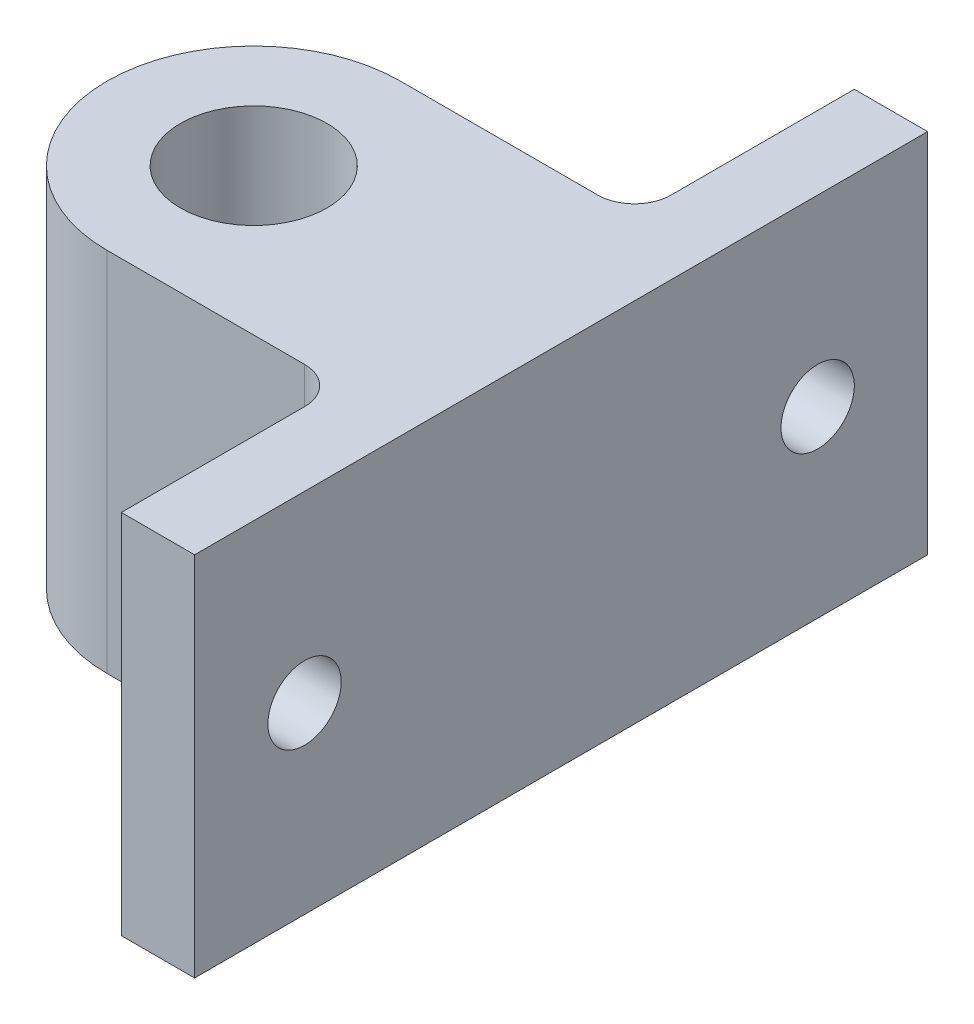
ISO-10303-21;
HEADER;
FILE_DESCRIPTION(('STEP AP214'),'2;1');
FILE_NAME('part.step','',(''),(''),'','','');
FILE_SCHEMA(('AUTOMOTIVE_DESIGN { 1 0 10303 214 1 1 1 1 }'));
ENDSEC;
DATA;
#1=APPLICATION_CONTEXT('core data for automotive mechanical design processes');
#2=APPLICATION_PROTOCOL_DEFINITION('international standard','automotive_design',2000,#1);
#3=PRODUCT_CONTEXT('',#1,'mechanical');
#4=PRODUCT('Part','Part','',(#3));
#5=PRODUCT_RELATED_PRODUCT_CATEGORY('part','',(#4));
#6=PRODUCT_DEFINITION_FORMATION('','',#4);
#7=PRODUCT_DEFINITION_CONTEXT('part definition',#1,'design');
#8=PRODUCT_DEFINITION('design','',#6,#7);
#9=PRODUCT_DEFINITION_SHAPE('','',#8);
#10=(LENGTH_UNIT() NAMED_UNIT(*) SI_UNIT(.MILLI.,.METRE.));
#11=(NAMED_UNIT(*) PLANE_ANGLE_UNIT() SI_UNIT($,.RADIAN.));
#12=(NAMED_UNIT(*) SI_UNIT($,.STERADIAN.) SOLID_ANGLE_UNIT());
#13=UNCERTAINTY_MEASURE_WITH_UNIT(LENGTH_MEASURE(1.E-05),#10,'distance_accuracy_value','');
#14=(GEOMETRIC_REPRESENTATION_CONTEXT(3) GLOBAL_UNCERTAINTY_ASSIGNED_CONTEXT((#13)) GLOBAL_UNIT_ASSIGNED_CONTEXT((#10,
#11,#12)) REPRESENTATION_CONTEXT('',''));
#15=CARTESIAN_POINT('',(0.,0.,0.));
#16=DIRECTION('',(0.,0.,1.));
#17=DIRECTION('',(1.,0.,0.));
#18=AXIS2_PLACEMENT_3D('',#15,#16,#17);
#19=CARTESIAN_POINT('',(-14.775,20.,0.));
#20=DIRECTION('',(0.,1.,0.));
#21=DIRECTION('',(0.,0.,1.));
#22=AXIS2_PLACEMENT_3D('',#19,#20,#21);
#23=PLANE('',#22);
#24=DIRECTION('',(0.,0.,1.));
#25=VECTOR('',#24,1.);
#26=CARTESIAN_POINT('',(-2.,20.,-8.));
#27=LINE('',#26,#25);
#28=CARTESIAN_POINT('',(-2.,20.,-20.));
#29=VERTEX_POINT('',#28);
#30=CARTESIAN_POINT('',(-2.,20.,-10.));
#31=VERTEX_POINT('',#30);
#32=EDGE_CURVE('E121',#29,#31,#27,.T.);
#33=ORIENTED_EDGE('',*,*,#32,.T.);
#34=CARTESIAN_POINT('',(-4.,20.,-10.));
#35=DIRECTION('',(0.,1.,0.));
#36=DIRECTION('',(0.,0.,1.));
#37=AXIS2_PLACEMENT_3D('',#34,#35,#36);
#38=CIRCLE('',#37,2.);
#39=CARTESIAN_POINT('',(-4.00000000000001,20.,-8.));
#40=VERTEX_POINT('',#39);
#41=EDGE_CURVE('E11',#31,#40,#38,.F.);
#42=ORIENTED_EDGE('',*,*,#41,.T.);
#43=DIRECTION('',(-1.,0.,0.));
#44=VECTOR('',#43,1.);
#45=CARTESIAN_POINT('',(-14.775,20.,-8.));
#46=LINE('',#45,#44);
#47=CARTESIAN_POINT('',(-14.775,20.,-8.));
#48=VERTEX_POINT('',#47);
#49=EDGE_CURVE('E110',#40,#48,#46,.T.);
#50=ORIENTED_EDGE('',*,*,#49,.T.);
#51=CARTESIAN_POINT('',(-14.775,20.,0.));
#52=DIRECTION('',(0.,1.,0.));
#53=DIRECTION('',(0.,0.,1.));
#54=AXIS2_PLACEMENT_3D('',#51,#52,#53);
#55=CIRCLE('',#54,8.);
#56=CARTESIAN_POINT('',(-14.775,20.,8.));
#57=VERTEX_POINT('',#56);
#58=EDGE_CURVE('E115',#48,#57,#55,.T.);
#59=ORIENTED_EDGE('',*,*,#58,.T.);
#60=DIRECTION('',(1.,0.,0.));
#61=VECTOR('',#60,1.);
#62=CARTESIAN_POINT('',(-14.775,20.,8.));
#63=LINE('',#62,#61);
#64=CARTESIAN_POINT('',(-4.00000000000001,20.,8.));
#65=VERTEX_POINT('',#64);
#66=EDGE_CURVE('E135',#57,#65,#63,.T.);
#67=ORIENTED_EDGE('',*,*,#66,.T.);
#68=CARTESIAN_POINT('',(-4.,20.,10.));
#69=DIRECTION('',(0.,1.,0.));
#70=DIRECTION('',(0.,0.,1.));
#71=AXIS2_PLACEMENT_3D('',#68,#69,#70);
#72=CIRCLE('',#71,2.);
#73=CARTESIAN_POINT('',(-2.,20.,10.));
#74=VERTEX_POINT('',#73);
#75=EDGE_CURVE('E195',#65,#74,#72,.F.);
#76=ORIENTED_EDGE('',*,*,#75,.T.);
#77=DIRECTION('',(0.,0.,1.));
#78=VECTOR('',#77,1.);
#79=CARTESIAN_POINT('',(-2.,20.,20.));
#80=LINE('',#79,#78);
#81=CARTESIAN_POINT('',(-2.,20.,20.));
#82=VERTEX_POINT('',#81);
#83=EDGE_CURVE('E137',#74,#82,#80,.T.);
#84=ORIENTED_EDGE('',*,*,#83,.T.);
#85=DIRECTION('',(1.,0.,0.));
#86=VECTOR('',#85,1.);
#87=CARTESIAN_POINT('',(2.,20.,20.));
#88=LINE('',#87,#86);
#89=CARTESIAN_POINT('',(2.,20.,20.));
#90=VERTEX_POINT('',#89);
#91=EDGE_CURVE('E142',#82,#90,#88,.T.);
#92=ORIENTED_EDGE('',*,*,#91,.T.);
#93=DIRECTION('',(0.,0.,-1.));
#94=VECTOR('',#93,1.);
#95=CARTESIAN_POINT('',(2.,20.,20.));
#96=LINE('',#95,#94);
#97=CARTESIAN_POINT('',(2.,20.,-20.));
#98=VERTEX_POINT('',#97);
#99=EDGE_CURVE('E144',#90,#98,#96,.T.);
#100=ORIENTED_EDGE('',*,*,#99,.T.);
#101=DIRECTION('',(-1.,0.,0.));
#102=VECTOR('',#101,1.);
#103=CARTESIAN_POINT('',(2.,20.,-20.));
#104=LINE('',#103,#102);
#105=EDGE_CURVE('E146',#98,#29,#104,.T.);
#106=ORIENTED_EDGE('',*,*,#105,.T.);
#107=EDGE_LOOP('',(#33,#42,#50,#59,#67,#76,#84,#92,#100,#106));
#108=FACE_BOUND('',#107,.T.);
#109=CARTESIAN_POINT('',(-14.775,20.,0.));
#110=DIRECTION('',(0.,1.,0.));
#111=DIRECTION('',(0.,0.,1.));
#112=AXIS2_PLACEMENT_3D('',#109,#110,#111);
#113=CIRCLE('',#112,4.);
#114=CARTESIAN_POINT('',(-14.775,20.,4.));
#115=VERTEX_POINT('',#114);
#116=EDGE_CURVE('E151',#115,#115,#113,.T.);
#117=ORIENTED_EDGE('',*,*,#116,.F.);
#118=EDGE_LOOP('',(#117));
#119=FACE_BOUND('',#118,.T.);
#120=ADVANCED_FACE('F34',(#108,#119),#23,.T.);
#121=CARTESIAN_POINT('',(-14.775,0.,0.));
#122=DIRECTION('',(0.,1.,0.));
#123=DIRECTION('',(0.,0.,1.));
#124=AXIS2_PLACEMENT_3D('',#121,#122,#123);
#125=PLANE('',#124);
#126=DIRECTION('',(0.,0.,1.));
#127=VECTOR('',#126,1.);
#128=CARTESIAN_POINT('',(-2.,0.,-8.));
#129=LINE('',#128,#127);
#130=CARTESIAN_POINT('',(-2.,0.,-20.));
#131=VERTEX_POINT('',#130);
#132=CARTESIAN_POINT('',(-2.,0.,-10.));
#133=VERTEX_POINT('',#132);
#134=EDGE_CURVE('E149',#131,#133,#129,.T.);
#135=ORIENTED_EDGE('',*,*,#134,.F.);
#136=DIRECTION('',(-1.,0.,0.));
#137=VECTOR('',#136,1.);
#138=CARTESIAN_POINT('',(2.,0.,-20.));
#139=LINE('',#138,#137);
#140=CARTESIAN_POINT('',(2.,0.,-20.));
#141=VERTEX_POINT('',#140);
#142=EDGE_CURVE('E164',#141,#131,#139,.T.);
#143=ORIENTED_EDGE('',*,*,#142,.F.);
#144=DIRECTION('',(0.,0.,-1.));
#145=VECTOR('',#144,1.);
#146=CARTESIAN_POINT('',(2.,0.,20.));
#147=LINE('',#146,#145);
#148=CARTESIAN_POINT('',(2.,0.,20.));
#149=VERTEX_POINT('',#148);
#150=EDGE_CURVE('E162',#149,#141,#147,.T.);
#151=ORIENTED_EDGE('',*,*,#150,.F.);
#152=DIRECTION('',(1.,0.,0.));
#153=VECTOR('',#152,1.);
#154=CARTESIAN_POINT('',(2.,0.,20.));
#155=LINE('',#154,#153);
#156=CARTESIAN_POINT('',(-2.,0.,20.));
#157=VERTEX_POINT('',#156);
#158=EDGE_CURVE('E160',#157,#149,#155,.T.);
#159=ORIENTED_EDGE('',*,*,#158,.F.);
#160=DIRECTION('',(0.,0.,1.));
#161=VECTOR('',#160,1.);
#162=CARTESIAN_POINT('',(-2.,0.,20.));
#163=LINE('',#162,#161);
#164=CARTESIAN_POINT('',(-2.,0.,10.));
#165=VERTEX_POINT('',#164);
#166=EDGE_CURVE('E158',#165,#157,#163,.T.);
#167=ORIENTED_EDGE('',*,*,#166,.F.);
#168=CARTESIAN_POINT('',(-4.,0.,10.));
#169=DIRECTION('',(0.,1.,0.));
#170=DIRECTION('',(0.,0.,1.));
#171=AXIS2_PLACEMENT_3D('',#168,#169,#170);
#172=CIRCLE('',#171,2.);
#173=CARTESIAN_POINT('',(-4.00000000000001,0.,8.));
#174=VERTEX_POINT('',#173);
#175=EDGE_CURVE('E193',#165,#174,#172,.T.);
#176=ORIENTED_EDGE('',*,*,#175,.T.);
#177=DIRECTION('',(1.,0.,0.));
#178=VECTOR('',#177,1.);
#179=CARTESIAN_POINT('',(-14.775,0.,8.));
#180=LINE('',#179,#178);
#181=CARTESIAN_POINT('',(-14.775,0.,8.));
#182=VERTEX_POINT('',#181);
#183=EDGE_CURVE('E155',#182,#174,#180,.T.);
#184=ORIENTED_EDGE('',*,*,#183,.F.);
#185=CARTESIAN_POINT('',(-14.775,0.,0.));
#186=DIRECTION('',(0.,1.,0.));
#187=DIRECTION('',(0.,0.,1.));
#188=AXIS2_PLACEMENT_3D('',#185,#186,#187);
#189=CIRCLE('',#188,8.);
#190=CARTESIAN_POINT('',(-14.775,0.,-8.));
#191=VERTEX_POINT('',#190);
#192=EDGE_CURVE('E153',#191,#182,#189,.T.);
#193=ORIENTED_EDGE('',*,*,#192,.F.);
#194=DIRECTION('',(-1.,0.,0.));
#195=VECTOR('',#194,1.);
#196=CARTESIAN_POINT('',(-14.775,0.,-8.));
#197=LINE('',#196,#195);
#198=CARTESIAN_POINT('',(-4.00000000000001,0.,-8.));
#199=VERTEX_POINT('',#198);
#200=EDGE_CURVE('E126',#199,#191,#197,.T.);
#201=ORIENTED_EDGE('',*,*,#200,.F.);
#202=CARTESIAN_POINT('',(-4.,0.,-10.));
#203=DIRECTION('',(0.,1.,0.));
#204=DIRECTION('',(0.,0.,1.));
#205=AXIS2_PLACEMENT_3D('',#202,#203,#204);
#206=CIRCLE('',#205,2.);
#207=EDGE_CURVE('E42',#199,#133,#206,.T.);
#208=ORIENTED_EDGE('',*,*,#207,.T.);
#209=EDGE_LOOP('',(#135,#143,#151,#159,#167,#176,#184,#193,#201,#208));
#210=FACE_BOUND('',#209,.T.);
#211=CARTESIAN_POINT('',(-14.775,0.,0.));
#212=DIRECTION('',(0.,1.,0.));
#213=DIRECTION('',(0.,0.,1.));
#214=AXIS2_PLACEMENT_3D('',#211,#212,#213);
#215=CIRCLE('',#214,4.);
#216=CARTESIAN_POINT('',(-14.775,0.,4.));
#217=VERTEX_POINT('',#216);
#218=EDGE_CURVE('E185',#217,#217,#215,.T.);
#219=ORIENTED_EDGE('',*,*,#218,.T.);
#220=EDGE_LOOP('',(#219));
#221=FACE_BOUND('',#220,.T.);
#222=ADVANCED_FACE('F208',(#210,#221),#125,.F.);
#223=CARTESIAN_POINT('',(-2.,20.,-8.));
#224=DIRECTION('',(1.,0.,0.));
#225=DIRECTION('',(0.,0.,-1.));
#226=AXIS2_PLACEMENT_3D('',#223,#224,#225);
#227=PLANE('',#226);
#228=CARTESIAN_POINT('',(-2.,10.,-14.));
#229=DIRECTION('',(-1.,0.,0.));
#230=DIRECTION('',(0.,0.,1.));
#231=AXIS2_PLACEMENT_3D('',#228,#229,#230);
#232=CIRCLE('',#231,2.);
#233=CARTESIAN_POINT('',(-2.,10.,-12.));
#234=VERTEX_POINT('',#233);
#235=EDGE_CURVE('E182',#234,#234,#232,.T.);
#236=ORIENTED_EDGE('',*,*,#235,.F.);
#237=EDGE_LOOP('',(#236));
#238=FACE_BOUND('',#237,.T.);
#239=ORIENTED_EDGE('',*,*,#134,.T.);
#240=DIRECTION('',(0.,-1.,0.));
#241=VECTOR('',#240,1.);
#242=CARTESIAN_POINT('',(-2.,20.,-10.));
#243=LINE('',#242,#241);
#244=EDGE_CURVE('E49',#133,#31,#243,.F.);
#245=ORIENTED_EDGE('',*,*,#244,.T.);
#246=ORIENTED_EDGE('',*,*,#32,.F.);
#247=DIRECTION('',(0.,-1.,0.));
#248=VECTOR('',#247,1.);
#249=CARTESIAN_POINT('',(-2.,20.,-20.));
#250=LINE('',#249,#248);
#251=EDGE_CURVE('E148',#29,#131,#250,.T.);
#252=ORIENTED_EDGE('',*,*,#251,.T.);
#253=EDGE_LOOP('',(#239,#245,#246,#252));
#254=FACE_BOUND('',#253,.T.);
#255=ADVANCED_FACE('F228',(#238,#254),#227,.F.);
#256=CARTESIAN_POINT('',(-14.775,20.,-8.));
#257=DIRECTION('',(0.,0.,1.));
#258=DIRECTION('',(1.,0.,0.));
#259=AXIS2_PLACEMENT_3D('',#256,#257,#258);
#260=PLANE('',#259);
#261=ORIENTED_EDGE('',*,*,#49,.F.);
#262=DIRECTION('',(0.,-1.,0.));
#263=VECTOR('',#262,1.);
#264=CARTESIAN_POINT('',(-4.,0.,-8.));
#265=LINE('',#264,#263);
#266=EDGE_CURVE('E190',#40,#199,#265,.T.);
#267=ORIENTED_EDGE('',*,*,#266,.T.);
#268=ORIENTED_EDGE('',*,*,#200,.T.);
#269=DIRECTION('',(0.,-1.,0.));
#270=VECTOR('',#269,1.);
#271=CARTESIAN_POINT('',(-14.775,20.,-8.));
#272=LINE('',#271,#270);
#273=EDGE_CURVE('E124',#48,#191,#272,.T.);
#274=ORIENTED_EDGE('',*,*,#273,.F.);
#275=EDGE_LOOP('',(#261,#267,#268,#274));
#276=FACE_BOUND('',#275,.T.);
#277=ADVANCED_FACE('F125',(#276),#260,.F.);
#278=CARTESIAN_POINT('',(-14.775,20.,0.));
#279=DIRECTION('',(0.,-1.,0.));
#280=DIRECTION('',(0.,0.,-1.));
#281=AXIS2_PLACEMENT_3D('',#278,#279,#280);
#282=CYLINDRICAL_SURFACE('',#281,8.);
#283=ORIENTED_EDGE('',*,*,#192,.T.);
#284=DIRECTION('',(0.,-1.,0.));
#285=VECTOR('',#284,1.);
#286=CARTESIAN_POINT('',(-14.775,20.,8.));
#287=LINE('',#286,#285);
#288=EDGE_CURVE('E130',#57,#182,#287,.T.);
#289=ORIENTED_EDGE('',*,*,#288,.F.);
#290=ORIENTED_EDGE('',*,*,#58,.F.);
#291=ORIENTED_EDGE('',*,*,#273,.T.);
#292=EDGE_LOOP('',(#283,#289,#290,#291));
#293=FACE_BOUND('',#292,.T.);
#294=ADVANCED_FACE('F132',(#293),#282,.T.);
#295=CARTESIAN_POINT('',(-14.775,20.,8.));
#296=DIRECTION('',(0.,0.,-1.));
#297=DIRECTION('',(-1.,0.,0.));
#298=AXIS2_PLACEMENT_3D('',#295,#296,#297);
#299=PLANE('',#298);
#300=ORIENTED_EDGE('',*,*,#183,.T.);
#301=DIRECTION('',(0.,-1.,0.));
#302=VECTOR('',#301,1.);
#303=CARTESIAN_POINT('',(-4.,20.,8.));
#304=LINE('',#303,#302);
#305=EDGE_CURVE('E188',#174,#65,#304,.F.);
#306=ORIENTED_EDGE('',*,*,#305,.T.);
#307=ORIENTED_EDGE('',*,*,#66,.F.);
#308=ORIENTED_EDGE('',*,*,#288,.T.);
#309=EDGE_LOOP('',(#300,#306,#307,#308));
#310=FACE_BOUND('',#309,.T.);
#311=ADVANCED_FACE('F212',(#310),#299,.F.);
#312=CARTESIAN_POINT('',(-2.,20.,20.));
#313=DIRECTION('',(1.,0.,0.));
#314=DIRECTION('',(0.,0.,-1.));
#315=AXIS2_PLACEMENT_3D('',#312,#313,#314);
#316=PLANE('',#315);
#317=CARTESIAN_POINT('',(-2.00000000000001,10.,14.));
#318=DIRECTION('',(-1.,0.,0.));
#319=DIRECTION('',(0.,0.,-1.));
#320=AXIS2_PLACEMENT_3D('',#317,#318,#319);
#321=CIRCLE('',#320,2.);
#322=CARTESIAN_POINT('',(-2.,10.,12.));
#323=VERTEX_POINT('',#322);
#324=EDGE_CURVE('E259',#323,#323,#321,.T.);
#325=ORIENTED_EDGE('',*,*,#324,.F.);
#326=EDGE_LOOP('',(#325));
#327=FACE_BOUND('',#326,.T.);
#328=ORIENTED_EDGE('',*,*,#83,.F.);
#329=DIRECTION('',(0.,-1.,0.));
#330=VECTOR('',#329,1.);
#331=CARTESIAN_POINT('',(-2.,0.,10.));
#332=LINE('',#331,#330);
#333=EDGE_CURVE('E129',#74,#165,#332,.T.);
#334=ORIENTED_EDGE('',*,*,#333,.T.);
#335=ORIENTED_EDGE('',*,*,#166,.T.);
#336=DIRECTION('',(0.,-1.,0.));
#337=VECTOR('',#336,1.);
#338=CARTESIAN_POINT('',(-2.,20.,20.));
#339=LINE('',#338,#337);
#340=EDGE_CURVE('E174',#82,#157,#339,.T.);
#341=ORIENTED_EDGE('',*,*,#340,.F.);
#342=EDGE_LOOP('',(#328,#334,#335,#341));
#343=FACE_BOUND('',#342,.T.);
#344=ADVANCED_FACE('F203',(#327,#343),#316,.F.);
#345=CARTESIAN_POINT('',(2.,20.,20.));
#346=DIRECTION('',(0.,0.,-1.));
#347=DIRECTION('',(-1.,0.,0.));
#348=AXIS2_PLACEMENT_3D('',#345,#346,#347);
#349=PLANE('',#348);
#350=ORIENTED_EDGE('',*,*,#158,.T.);
#351=DIRECTION('',(0.,-1.,0.));
#352=VECTOR('',#351,1.);
#353=CARTESIAN_POINT('',(2.,20.,20.));
#354=LINE('',#353,#352);
#355=EDGE_CURVE('E171',#90,#149,#354,.T.);
#356=ORIENTED_EDGE('',*,*,#355,.F.);
#357=ORIENTED_EDGE('',*,*,#91,.F.);
#358=ORIENTED_EDGE('',*,*,#340,.T.);
#359=EDGE_LOOP('',(#350,#356,#357,#358));
#360=FACE_BOUND('',#359,.T.);
#361=ADVANCED_FACE('F219',(#360),#349,.F.);
#362=CARTESIAN_POINT('',(2.,20.,20.));
#363=DIRECTION('',(-1.,0.,0.));
#364=DIRECTION('',(0.,0.,1.));
#365=AXIS2_PLACEMENT_3D('',#362,#363,#364);
#366=PLANE('',#365);
#367=CARTESIAN_POINT('',(2.,10.,-14.));
#368=DIRECTION('',(-1.,0.,0.));
#369=DIRECTION('',(0.,0.,1.));
#370=AXIS2_PLACEMENT_3D('',#367,#368,#369);
#371=CIRCLE('',#370,2.);
#372=CARTESIAN_POINT('',(2.,10.,-12.));
#373=VERTEX_POINT('',#372);
#374=EDGE_CURVE('E181',#373,#373,#371,.T.);
#375=ORIENTED_EDGE('',*,*,#374,.T.);
#376=EDGE_LOOP('',(#375));
#377=FACE_BOUND('',#376,.T.);
#378=CARTESIAN_POINT('',(2.,10.,14.));
#379=DIRECTION('',(-1.,0.,0.));
#380=DIRECTION('',(0.,0.,1.));
#381=AXIS2_PLACEMENT_3D('',#378,#379,#380);
#382=CIRCLE('',#381,2.);
#383=CARTESIAN_POINT('',(2.,10.,16.));
#384=VERTEX_POINT('',#383);
#385=EDGE_CURVE('E178',#384,#384,#382,.T.);
#386=ORIENTED_EDGE('',*,*,#385,.T.);
#387=EDGE_LOOP('',(#386));
#388=FACE_BOUND('',#387,.T.);
#389=ORIENTED_EDGE('',*,*,#150,.T.);
#390=DIRECTION('',(0.,-1.,0.));
#391=VECTOR('',#390,1.);
#392=CARTESIAN_POINT('',(2.,20.,-20.));
#393=LINE('',#392,#391);
#394=EDGE_CURVE('E168',#98,#141,#393,.T.);
#395=ORIENTED_EDGE('',*,*,#394,.F.);
#396=ORIENTED_EDGE('',*,*,#99,.F.);
#397=ORIENTED_EDGE('',*,*,#355,.T.);
#398=EDGE_LOOP('',(#389,#395,#396,#397));
#399=FACE_BOUND('',#398,.T.);
#400=ADVANCED_FACE('F237',(#377,#388,#399),#366,.F.);
#401=CARTESIAN_POINT('',(2.,20.,-20.));
#402=DIRECTION('',(0.,0.,1.));
#403=DIRECTION('',(1.,0.,0.));
#404=AXIS2_PLACEMENT_3D('',#401,#402,#403);
#405=PLANE('',#404);
#406=ORIENTED_EDGE('',*,*,#142,.T.);
#407=ORIENTED_EDGE('',*,*,#251,.F.);
#408=ORIENTED_EDGE('',*,*,#105,.F.);
#409=ORIENTED_EDGE('',*,*,#394,.T.);
#410=EDGE_LOOP('',(#406,#407,#408,#409));
#411=FACE_BOUND('',#410,.T.);
#412=ADVANCED_FACE('F234',(#411),#405,.F.);
#413=CARTESIAN_POINT('',(-14.775,20.,0.));
#414=DIRECTION('',(0.,-1.,0.));
#415=DIRECTION('',(0.,0.,-1.));
#416=AXIS2_PLACEMENT_3D('',#413,#414,#415);
#417=CYLINDRICAL_SURFACE('',#416,4.);
#418=ORIENTED_EDGE('',*,*,#116,.T.);
#419=EDGE_LOOP('',(#418));
#420=FACE_BOUND('',#419,.T.);
#421=ORIENTED_EDGE('',*,*,#218,.F.);
#422=EDGE_LOOP('',(#421));
#423=FACE_BOUND('',#422,.T.);
#424=ADVANCED_FACE('F231',(#420,#423),#417,.F.);
#425=CARTESIAN_POINT('',(18.,10.,14.));
#426=DIRECTION('',(-1.,0.,0.));
#427=DIRECTION('',(0.,0.,1.));
#428=AXIS2_PLACEMENT_3D('',#425,#426,#427);
#429=CYLINDRICAL_SURFACE('',#428,2.);
#430=ORIENTED_EDGE('',*,*,#324,.T.);
#431=EDGE_LOOP('',(#430));
#432=FACE_BOUND('',#431,.T.);
#433=ORIENTED_EDGE('',*,*,#385,.F.);
#434=EDGE_LOOP('',(#433));
#435=FACE_BOUND('',#434,.T.);
#436=ADVANCED_FACE('F280',(#432,#435),#429,.F.);
#437=CARTESIAN_POINT('',(18.,10.,-14.));
#438=DIRECTION('',(-1.,0.,0.));
#439=DIRECTION('',(0.,0.,1.));
#440=AXIS2_PLACEMENT_3D('',#437,#438,#439);
#441=CYLINDRICAL_SURFACE('',#440,2.);
#442=ORIENTED_EDGE('',*,*,#235,.T.);
#443=EDGE_LOOP('',(#442));
#444=FACE_BOUND('',#443,.T.);
#445=ORIENTED_EDGE('',*,*,#374,.F.);
#446=EDGE_LOOP('',(#445));
#447=FACE_BOUND('',#446,.T.);
#448=ADVANCED_FACE('F265',(#444,#447),#441,.F.);
#449=CARTESIAN_POINT('',(-4.,20.,10.));
#450=DIRECTION('',(0.,1.,0.));
#451=DIRECTION('',(0.,0.,1.));
#452=AXIS2_PLACEMENT_3D('',#449,#450,#451);
#453=CYLINDRICAL_SURFACE('',#452,2.);
#454=ORIENTED_EDGE('',*,*,#75,.F.);
#455=ORIENTED_EDGE('',*,*,#305,.F.);
#456=ORIENTED_EDGE('',*,*,#175,.F.);
#457=ORIENTED_EDGE('',*,*,#333,.F.);
#458=EDGE_LOOP('',(#454,#455,#456,#457));
#459=FACE_BOUND('',#458,.T.);
#460=ADVANCED_FACE('F206',(#459),#453,.F.);
#461=CARTESIAN_POINT('',(-4.,20.,-10.));
#462=DIRECTION('',(0.,1.,0.));
#463=DIRECTION('',(0.,0.,1.));
#464=AXIS2_PLACEMENT_3D('',#461,#462,#463);
#465=CYLINDRICAL_SURFACE('',#464,2.);
#466=ORIENTED_EDGE('',*,*,#41,.F.);
#467=ORIENTED_EDGE('',*,*,#244,.F.);
#468=ORIENTED_EDGE('',*,*,#207,.F.);
#469=ORIENTED_EDGE('',*,*,#266,.F.);
#470=EDGE_LOOP('',(#466,#467,#468,#469));
#471=FACE_BOUND('',#470,.T.);
#472=ADVANCED_FACE('F36',(#471),#465,.F.);
#473=CLOSED_SHELL('',(#120,#222,#255,#277,#294,#311,#344,#361,#400,#412,#424,#436,#448,#460,#472));
#474=MANIFOLD_SOLID_BREP('B2',#473);
#475=ADVANCED_BREP_SHAPE_REPRESENTATION('',(#18,#474),#14);
#476=SHAPE_DEFINITION_REPRESENTATION(#9,#475);
ENDSEC;
END-ISO-10303-21;
